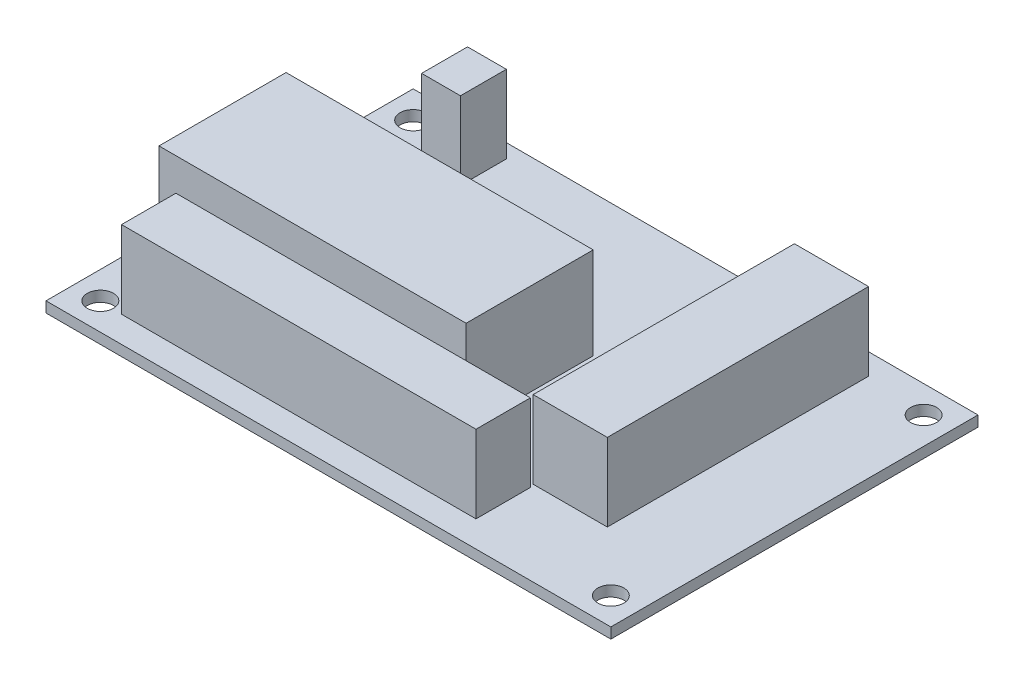
ISO-10303-21;
HEADER;
FILE_DESCRIPTION(('STEP AP214'),'2;1');
FILE_NAME('part.step','',(''),(''),'','','');
FILE_SCHEMA(('AUTOMOTIVE_DESIGN { 1 0 10303 214 1 1 1 1 }'));
ENDSEC;
DATA;
#1=APPLICATION_CONTEXT('core data for automotive mechanical design processes');
#2=APPLICATION_PROTOCOL_DEFINITION('international standard','automotive_design',2000,#1);
#3=PRODUCT_CONTEXT('',#1,'mechanical');
#4=PRODUCT('Part','Part','',(#3));
#5=PRODUCT_RELATED_PRODUCT_CATEGORY('part','',(#4));
#6=PRODUCT_DEFINITION_FORMATION('','',#4);
#7=PRODUCT_DEFINITION_CONTEXT('part definition',#1,'design');
#8=PRODUCT_DEFINITION('design','',#6,#7);
#9=PRODUCT_DEFINITION_SHAPE('','',#8);
#10=(LENGTH_UNIT() NAMED_UNIT(*) SI_UNIT(.MILLI.,.METRE.));
#11=(NAMED_UNIT(*) PLANE_ANGLE_UNIT() SI_UNIT($,.RADIAN.));
#12=(NAMED_UNIT(*) SI_UNIT($,.STERADIAN.) SOLID_ANGLE_UNIT());
#13=UNCERTAINTY_MEASURE_WITH_UNIT(LENGTH_MEASURE(1.E-05),#10,'distance_accuracy_value','');
#14=(GEOMETRIC_REPRESENTATION_CONTEXT(3) GLOBAL_UNCERTAINTY_ASSIGNED_CONTEXT((#13)) GLOBAL_UNIT_ASSIGNED_CONTEXT((#10,
#11,#12)) REPRESENTATION_CONTEXT('',''));
#15=CARTESIAN_POINT('',(0.,0.,0.));
#16=DIRECTION('',(0.,0.,1.));
#17=DIRECTION('',(1.,0.,0.));
#18=AXIS2_PLACEMENT_3D('',#15,#16,#17);
#19=CARTESIAN_POINT('',(0.,1.5,0.));
#20=DIRECTION('',(0.,-1.,0.));
#21=DIRECTION('',(0.,0.,-1.));
#22=AXIS2_PLACEMENT_3D('',#19,#20,#21);
#23=PLANE('',#22);
#24=DIRECTION('',(0.,0.,1.));
#25=VECTOR('',#24,1.);
#26=CARTESIAN_POINT('',(7.,1.5,-11.4));
#27=LINE('',#26,#25);
#28=CARTESIAN_POINT('',(7.,1.5,-11.4));
#29=VERTEX_POINT('',#28);
#30=CARTESIAN_POINT('',(7.,1.5,-3.7));
#31=VERTEX_POINT('',#30);
#32=EDGE_CURVE('E193',#29,#31,#27,.T.);
#33=ORIENTED_EDGE('',*,*,#32,.F.);
#34=DIRECTION('',(-1.,0.,0.));
#35=VECTOR('',#34,1.);
#36=CARTESIAN_POINT('',(7.,1.5,-11.4));
#37=LINE('',#36,#35);
#38=CARTESIAN_POINT('',(57.2,1.5,-11.4));
#39=VERTEX_POINT('',#38);
#40=EDGE_CURVE('E206',#39,#29,#37,.T.);
#41=ORIENTED_EDGE('',*,*,#40,.F.);
#42=DIRECTION('',(0.,0.,-1.));
#43=VECTOR('',#42,1.);
#44=CARTESIAN_POINT('',(57.2,1.5,-11.4));
#45=LINE('',#44,#43);
#46=CARTESIAN_POINT('',(57.2,1.5,-3.7));
#47=VERTEX_POINT('',#46);
#48=EDGE_CURVE('E215',#47,#39,#45,.T.);
#49=ORIENTED_EDGE('',*,*,#48,.F.);
#50=DIRECTION('',(1.,0.,0.));
#51=VECTOR('',#50,1.);
#52=CARTESIAN_POINT('',(7.,1.5,-3.7));
#53=LINE('',#52,#51);
#54=EDGE_CURVE('E196',#31,#47,#53,.T.);
#55=ORIENTED_EDGE('',*,*,#54,.F.);
#56=EDGE_LOOP('',(#33,#41,#49,#55));
#57=FACE_BOUND('',#56,.T.);
#58=DIRECTION('',(0.,0.,1.));
#59=VECTOR('',#58,1.);
#60=CARTESIAN_POINT('',(2.,1.5,-32.));
#61=LINE('',#60,#59);
#62=CARTESIAN_POINT('',(2.,1.5,-32.));
#63=VERTEX_POINT('',#62);
#64=CARTESIAN_POINT('',(2.,1.5,-14.));
#65=VERTEX_POINT('',#64);
#66=EDGE_CURVE('E264',#63,#65,#61,.T.);
#67=ORIENTED_EDGE('',*,*,#66,.F.);
#68=DIRECTION('',(-1.,0.,0.));
#69=VECTOR('',#68,1.);
#70=CARTESIAN_POINT('',(2.,1.5,-32.));
#71=LINE('',#70,#69);
#72=CARTESIAN_POINT('',(45.5,1.5,-32.));
#73=VERTEX_POINT('',#72);
#74=EDGE_CURVE('E269',#73,#63,#71,.T.);
#75=ORIENTED_EDGE('',*,*,#74,.F.);
#76=DIRECTION('',(0.,0.,-1.));
#77=VECTOR('',#76,1.);
#78=CARTESIAN_POINT('',(45.5,1.5,-32.));
#79=LINE('',#78,#77);
#80=CARTESIAN_POINT('',(45.5,1.5,-14.));
#81=VERTEX_POINT('',#80);
#82=EDGE_CURVE('E281',#81,#73,#79,.T.);
#83=ORIENTED_EDGE('',*,*,#82,.F.);
#84=DIRECTION('',(1.,0.,0.));
#85=VECTOR('',#84,1.);
#86=CARTESIAN_POINT('',(2.,1.5,-14.));
#87=LINE('',#86,#85);
#88=EDGE_CURVE('E278',#65,#81,#87,.T.);
#89=ORIENTED_EDGE('',*,*,#88,.F.);
#90=EDGE_LOOP('',(#67,#75,#83,#89));
#91=FACE_BOUND('',#90,.T.);
#92=CARTESIAN_POINT('',(76.15,1.5,-48.15));
#93=DIRECTION('',(0.,1.,0.));
#94=DIRECTION('',(0.,0.,1.));
#95=AXIS2_PLACEMENT_3D('',#92,#93,#94);
#96=CIRCLE('',#95,1.85000000000001);
#97=CARTESIAN_POINT('',(76.15,1.5,-46.3));
#98=VERTEX_POINT('',#97);
#99=EDGE_CURVE('E304',#98,#98,#96,.T.);
#100=ORIENTED_EDGE('',*,*,#99,.F.);
#101=EDGE_LOOP('',(#100));
#102=FACE_BOUND('',#101,.T.);
#103=CARTESIAN_POINT('',(3.85,1.5,-48.15));
#104=DIRECTION('',(0.,1.,0.));
#105=DIRECTION('',(0.,0.,1.));
#106=AXIS2_PLACEMENT_3D('',#103,#104,#105);
#107=CIRCLE('',#106,1.85);
#108=CARTESIAN_POINT('',(3.85,1.5,-46.3));
#109=VERTEX_POINT('',#108);
#110=EDGE_CURVE('E316',#109,#109,#107,.T.);
#111=ORIENTED_EDGE('',*,*,#110,.F.);
#112=EDGE_LOOP('',(#111));
#113=FACE_BOUND('',#112,.T.);
#114=DIRECTION('',(0.,0.,1.));
#115=VECTOR('',#114,1.);
#116=CARTESIAN_POINT('',(0.,1.5,0.));
#117=LINE('',#116,#115);
#118=CARTESIAN_POINT('',(0.,1.5,-52.));
#119=VERTEX_POINT('',#118);
#120=CARTESIAN_POINT('',(0.,1.5,0.));
#121=VERTEX_POINT('',#120);
#122=EDGE_CURVE('E322',#119,#121,#117,.T.);
#123=ORIENTED_EDGE('',*,*,#122,.T.);
#124=DIRECTION('',(1.,0.,0.));
#125=VECTOR('',#124,1.);
#126=CARTESIAN_POINT('',(0.,1.5,0.));
#127=LINE('',#126,#125);
#128=CARTESIAN_POINT('',(80.,1.5,0.));
#129=VERTEX_POINT('',#128);
#130=EDGE_CURVE('E325',#121,#129,#127,.T.);
#131=ORIENTED_EDGE('',*,*,#130,.T.);
#132=DIRECTION('',(0.,0.,-1.));
#133=VECTOR('',#132,1.);
#134=CARTESIAN_POINT('',(80.,1.5,0.));
#135=LINE('',#134,#133);
#136=CARTESIAN_POINT('',(80.,1.5,-52.));
#137=VERTEX_POINT('',#136);
#138=EDGE_CURVE('E328',#129,#137,#135,.T.);
#139=ORIENTED_EDGE('',*,*,#138,.T.);
#140=DIRECTION('',(-1.,0.,0.));
#141=VECTOR('',#140,1.);
#142=CARTESIAN_POINT('',(0.,1.5,-52.));
#143=LINE('',#142,#141);
#144=EDGE_CURVE('E330',#137,#119,#143,.T.);
#145=ORIENTED_EDGE('',*,*,#144,.T.);
#146=EDGE_LOOP('',(#123,#131,#139,#145));
#147=FACE_BOUND('',#146,.T.);
#148=CARTESIAN_POINT('',(3.85,1.5,-3.85));
#149=DIRECTION('',(0.,1.,0.));
#150=DIRECTION('',(0.,0.,1.));
#151=AXIS2_PLACEMENT_3D('',#148,#149,#150);
#152=CIRCLE('',#151,1.85);
#153=CARTESIAN_POINT('',(3.85,1.5,-2.));
#154=VERTEX_POINT('',#153);
#155=EDGE_CURVE('E310',#154,#154,#152,.T.);
#156=ORIENTED_EDGE('',*,*,#155,.F.);
#157=EDGE_LOOP('',(#156));
#158=FACE_BOUND('',#157,.T.);
#159=CARTESIAN_POINT('',(76.15,1.5,-3.85));
#160=DIRECTION('',(0.,1.,0.));
#161=DIRECTION('',(0.,0.,1.));
#162=AXIS2_PLACEMENT_3D('',#159,#160,#161);
#163=CIRCLE('',#162,1.85);
#164=CARTESIAN_POINT('',(76.15,1.5,-1.99999999999999));
#165=VERTEX_POINT('',#164);
#166=EDGE_CURVE('E298',#165,#165,#163,.T.);
#167=ORIENTED_EDGE('',*,*,#166,.F.);
#168=EDGE_LOOP('',(#167));
#169=FACE_BOUND('',#168,.T.);
#170=DIRECTION('',(0.,0.,1.));
#171=VECTOR('',#170,1.);
#172=CARTESIAN_POINT('',(57.,1.5,-49.));
#173=LINE('',#172,#171);
#174=CARTESIAN_POINT('',(57.,1.5,-49.));
#175=VERTEX_POINT('',#174);
#176=CARTESIAN_POINT('',(57.,1.5,-12.));
#177=VERTEX_POINT('',#176);
#178=EDGE_CURVE('E231',#175,#177,#173,.T.);
#179=ORIENTED_EDGE('',*,*,#178,.F.);
#180=DIRECTION('',(-1.,0.,0.));
#181=VECTOR('',#180,1.);
#182=CARTESIAN_POINT('',(57.,1.5,-49.));
#183=LINE('',#182,#181);
#184=CARTESIAN_POINT('',(67.5,1.5,-49.));
#185=VERTEX_POINT('',#184);
#186=EDGE_CURVE('E236',#185,#175,#183,.T.);
#187=ORIENTED_EDGE('',*,*,#186,.F.);
#188=DIRECTION('',(0.,0.,-1.));
#189=VECTOR('',#188,1.);
#190=CARTESIAN_POINT('',(67.5,1.5,-49.));
#191=LINE('',#190,#189);
#192=CARTESIAN_POINT('',(67.5,1.5,-12.));
#193=VERTEX_POINT('',#192);
#194=EDGE_CURVE('E248',#193,#185,#191,.T.);
#195=ORIENTED_EDGE('',*,*,#194,.F.);
#196=DIRECTION('',(1.,0.,0.));
#197=VECTOR('',#196,1.);
#198=CARTESIAN_POINT('',(57.,1.5,-12.));
#199=LINE('',#198,#197);
#200=EDGE_CURVE('E245',#177,#193,#199,.T.);
#201=ORIENTED_EDGE('',*,*,#200,.F.);
#202=EDGE_LOOP('',(#179,#187,#195,#201));
#203=FACE_BOUND('',#202,.T.);
#204=DIRECTION('',(0.,0.,1.));
#205=VECTOR('',#204,1.);
#206=CARTESIAN_POINT('',(9.69999999999999,1.5,-43.5));
#207=LINE('',#206,#205);
#208=CARTESIAN_POINT('',(9.69999999999999,1.5,-50.));
#209=VERTEX_POINT('',#208);
#210=CARTESIAN_POINT('',(9.69999999999999,1.5,-43.5));
#211=VERTEX_POINT('',#210);
#212=EDGE_CURVE('E192',#209,#211,#207,.T.);
#213=ORIENTED_EDGE('',*,*,#212,.F.);
#214=DIRECTION('',(-1.,0.,0.));
#215=VECTOR('',#214,1.);
#216=CARTESIAN_POINT('',(9.69999999999999,1.5,-50.));
#217=LINE('',#216,#215);
#218=CARTESIAN_POINT('',(15.2,1.5,-50.));
#219=VERTEX_POINT('',#218);
#220=EDGE_CURVE('E189',#219,#209,#217,.T.);
#221=ORIENTED_EDGE('',*,*,#220,.F.);
#222=DIRECTION('',(0.,0.,-1.));
#223=VECTOR('',#222,1.);
#224=CARTESIAN_POINT('',(15.2,1.5,-43.5));
#225=LINE('',#224,#223);
#226=CARTESIAN_POINT('',(15.2,1.5,-43.5));
#227=VERTEX_POINT('',#226);
#228=EDGE_CURVE('E55',#227,#219,#225,.T.);
#229=ORIENTED_EDGE('',*,*,#228,.F.);
#230=DIRECTION('',(1.,0.,0.));
#231=VECTOR('',#230,1.);
#232=CARTESIAN_POINT('',(9.69999999999999,1.5,-43.5));
#233=LINE('',#232,#231);
#234=EDGE_CURVE('E50',#211,#227,#233,.T.);
#235=ORIENTED_EDGE('',*,*,#234,.F.);
#236=EDGE_LOOP('',(#213,#221,#229,#235));
#237=FACE_BOUND('',#236,.T.);
#238=ADVANCED_FACE('F35',(#57,#91,#102,#113,#147,#158,#169,#203,#237),#23,.F.);
#239=CARTESIAN_POINT('',(0.,0.,0.));
#240=DIRECTION('',(0.,-1.,0.));
#241=DIRECTION('',(0.,0.,-1.));
#242=AXIS2_PLACEMENT_3D('',#239,#240,#241);
#243=PLANE('',#242);
#244=CARTESIAN_POINT('',(76.15,0.,-48.15));
#245=DIRECTION('',(0.,1.,0.));
#246=DIRECTION('',(0.,0.,1.));
#247=AXIS2_PLACEMENT_3D('',#244,#245,#246);
#248=CIRCLE('',#247,1.85000000000001);
#249=CARTESIAN_POINT('',(76.15,0.,-46.3));
#250=VERTEX_POINT('',#249);
#251=EDGE_CURVE('E301',#250,#250,#248,.T.);
#252=ORIENTED_EDGE('',*,*,#251,.T.);
#253=EDGE_LOOP('',(#252));
#254=FACE_BOUND('',#253,.T.);
#255=CARTESIAN_POINT('',(3.85,0.,-48.15));
#256=DIRECTION('',(0.,1.,0.));
#257=DIRECTION('',(0.,0.,1.));
#258=AXIS2_PLACEMENT_3D('',#255,#256,#257);
#259=CIRCLE('',#258,1.85);
#260=CARTESIAN_POINT('',(3.85,0.,-46.3));
#261=VERTEX_POINT('',#260);
#262=EDGE_CURVE('E313',#261,#261,#259,.T.);
#263=ORIENTED_EDGE('',*,*,#262,.T.);
#264=EDGE_LOOP('',(#263));
#265=FACE_BOUND('',#264,.T.);
#266=DIRECTION('',(0.,0.,1.));
#267=VECTOR('',#266,1.);
#268=CARTESIAN_POINT('',(0.,0.,0.));
#269=LINE('',#268,#267);
#270=CARTESIAN_POINT('',(0.,0.,-52.));
#271=VERTEX_POINT('',#270);
#272=CARTESIAN_POINT('',(0.,0.,0.));
#273=VERTEX_POINT('',#272);
#274=EDGE_CURVE('E319',#271,#273,#269,.T.);
#275=ORIENTED_EDGE('',*,*,#274,.F.);
#276=DIRECTION('',(-1.,0.,0.));
#277=VECTOR('',#276,1.);
#278=CARTESIAN_POINT('',(0.,0.,-52.));
#279=LINE('',#278,#277);
#280=CARTESIAN_POINT('',(80.,0.,-52.));
#281=VERTEX_POINT('',#280);
#282=EDGE_CURVE('E326',#281,#271,#279,.T.);
#283=ORIENTED_EDGE('',*,*,#282,.F.);
#284=DIRECTION('',(0.,0.,-1.));
#285=VECTOR('',#284,1.);
#286=CARTESIAN_POINT('',(80.,0.,0.));
#287=LINE('',#286,#285);
#288=CARTESIAN_POINT('',(80.,0.,0.));
#289=VERTEX_POINT('',#288);
#290=EDGE_CURVE('E337',#289,#281,#287,.T.);
#291=ORIENTED_EDGE('',*,*,#290,.F.);
#292=DIRECTION('',(1.,0.,0.));
#293=VECTOR('',#292,1.);
#294=CARTESIAN_POINT('',(0.,0.,0.));
#295=LINE('',#294,#293);
#296=EDGE_CURVE('E335',#273,#289,#295,.T.);
#297=ORIENTED_EDGE('',*,*,#296,.F.);
#298=EDGE_LOOP('',(#275,#283,#291,#297));
#299=FACE_BOUND('',#298,.T.);
#300=CARTESIAN_POINT('',(3.85,0.,-3.85));
#301=DIRECTION('',(0.,1.,0.));
#302=DIRECTION('',(0.,0.,1.));
#303=AXIS2_PLACEMENT_3D('',#300,#301,#302);
#304=CIRCLE('',#303,1.85);
#305=CARTESIAN_POINT('',(3.85,0.,-2.));
#306=VERTEX_POINT('',#305);
#307=EDGE_CURVE('E307',#306,#306,#304,.T.);
#308=ORIENTED_EDGE('',*,*,#307,.T.);
#309=EDGE_LOOP('',(#308));
#310=FACE_BOUND('',#309,.T.);
#311=CARTESIAN_POINT('',(76.15,0.,-3.85));
#312=DIRECTION('',(0.,1.,0.));
#313=DIRECTION('',(0.,0.,1.));
#314=AXIS2_PLACEMENT_3D('',#311,#312,#313);
#315=CIRCLE('',#314,1.85);
#316=CARTESIAN_POINT('',(76.15,0.,-1.99999999999999));
#317=VERTEX_POINT('',#316);
#318=EDGE_CURVE('E297',#317,#317,#315,.T.);
#319=ORIENTED_EDGE('',*,*,#318,.T.);
#320=EDGE_LOOP('',(#319));
#321=FACE_BOUND('',#320,.T.);
#322=ADVANCED_FACE('F355',(#254,#265,#299,#310,#321),#243,.T.);
#323=CARTESIAN_POINT('',(0.,1.5,0.));
#324=DIRECTION('',(1.,0.,0.));
#325=DIRECTION('',(0.,0.,-1.));
#326=AXIS2_PLACEMENT_3D('',#323,#324,#325);
#327=PLANE('',#326);
#328=ORIENTED_EDGE('',*,*,#274,.T.);
#329=DIRECTION('',(0.,-1.,0.));
#330=VECTOR('',#329,1.);
#331=CARTESIAN_POINT('',(0.,1.5,0.));
#332=LINE('',#331,#330);
#333=EDGE_CURVE('E11',#121,#273,#332,.T.);
#334=ORIENTED_EDGE('',*,*,#333,.F.);
#335=ORIENTED_EDGE('',*,*,#122,.F.);
#336=DIRECTION('',(0.,-1.,0.));
#337=VECTOR('',#336,1.);
#338=CARTESIAN_POINT('',(0.,1.5,-52.));
#339=LINE('',#338,#337);
#340=EDGE_CURVE('E332',#119,#271,#339,.T.);
#341=ORIENTED_EDGE('',*,*,#340,.T.);
#342=EDGE_LOOP('',(#328,#334,#335,#341));
#343=FACE_BOUND('',#342,.T.);
#344=ADVANCED_FACE('F37',(#343),#327,.F.);
#345=CARTESIAN_POINT('',(0.,1.5,0.));
#346=DIRECTION('',(0.,0.,-1.));
#347=DIRECTION('',(-1.,0.,0.));
#348=AXIS2_PLACEMENT_3D('',#345,#346,#347);
#349=PLANE('',#348);
#350=ORIENTED_EDGE('',*,*,#296,.T.);
#351=DIRECTION('',(0.,-1.,0.));
#352=VECTOR('',#351,1.);
#353=CARTESIAN_POINT('',(80.,1.5,0.));
#354=LINE('',#353,#352);
#355=EDGE_CURVE('E43',#129,#289,#354,.T.);
#356=ORIENTED_EDGE('',*,*,#355,.F.);
#357=ORIENTED_EDGE('',*,*,#130,.F.);
#358=ORIENTED_EDGE('',*,*,#333,.T.);
#359=EDGE_LOOP('',(#350,#356,#357,#358));
#360=FACE_BOUND('',#359,.T.);
#361=ADVANCED_FACE('F366',(#360),#349,.F.);
#362=CARTESIAN_POINT('',(80.,1.5,0.));
#363=DIRECTION('',(-1.,0.,0.));
#364=DIRECTION('',(0.,0.,1.));
#365=AXIS2_PLACEMENT_3D('',#362,#363,#364);
#366=PLANE('',#365);
#367=ORIENTED_EDGE('',*,*,#290,.T.);
#368=DIRECTION('',(0.,-1.,0.));
#369=VECTOR('',#368,1.);
#370=CARTESIAN_POINT('',(80.,1.5,-52.));
#371=LINE('',#370,#369);
#372=EDGE_CURVE('E342',#137,#281,#371,.T.);
#373=ORIENTED_EDGE('',*,*,#372,.F.);
#374=ORIENTED_EDGE('',*,*,#138,.F.);
#375=ORIENTED_EDGE('',*,*,#355,.T.);
#376=EDGE_LOOP('',(#367,#373,#374,#375));
#377=FACE_BOUND('',#376,.T.);
#378=ADVANCED_FACE('F349',(#377),#366,.F.);
#379=CARTESIAN_POINT('',(0.,1.5,-52.));
#380=DIRECTION('',(0.,0.,1.));
#381=DIRECTION('',(1.,0.,0.));
#382=AXIS2_PLACEMENT_3D('',#379,#380,#381);
#383=PLANE('',#382);
#384=ORIENTED_EDGE('',*,*,#282,.T.);
#385=ORIENTED_EDGE('',*,*,#340,.F.);
#386=ORIENTED_EDGE('',*,*,#144,.F.);
#387=ORIENTED_EDGE('',*,*,#372,.T.);
#388=EDGE_LOOP('',(#384,#385,#386,#387));
#389=FACE_BOUND('',#388,.T.);
#390=ADVANCED_FACE('F359',(#389),#383,.F.);
#391=CARTESIAN_POINT('',(3.85,1.5,-48.15));
#392=DIRECTION('',(0.,-1.,0.));
#393=DIRECTION('',(0.,0.,-1.));
#394=AXIS2_PLACEMENT_3D('',#391,#392,#393);
#395=CYLINDRICAL_SURFACE('',#394,1.85);
#396=ORIENTED_EDGE('',*,*,#110,.T.);
#397=EDGE_LOOP('',(#396));
#398=FACE_BOUND('',#397,.T.);
#399=ORIENTED_EDGE('',*,*,#262,.F.);
#400=EDGE_LOOP('',(#399));
#401=FACE_BOUND('',#400,.T.);
#402=ADVANCED_FACE('F385',(#398,#401),#395,.F.);
#403=CARTESIAN_POINT('',(3.85,1.5,-3.85));
#404=DIRECTION('',(0.,-1.,0.));
#405=DIRECTION('',(0.,0.,-1.));
#406=AXIS2_PLACEMENT_3D('',#403,#404,#405);
#407=CYLINDRICAL_SURFACE('',#406,1.85);
#408=ORIENTED_EDGE('',*,*,#155,.T.);
#409=EDGE_LOOP('',(#408));
#410=FACE_BOUND('',#409,.T.);
#411=ORIENTED_EDGE('',*,*,#307,.F.);
#412=EDGE_LOOP('',(#411));
#413=FACE_BOUND('',#412,.T.);
#414=ADVANCED_FACE('F392',(#410,#413),#407,.F.);
#415=CARTESIAN_POINT('',(76.15,1.5,-48.15));
#416=DIRECTION('',(0.,-1.,0.));
#417=DIRECTION('',(0.,0.,-1.));
#418=AXIS2_PLACEMENT_3D('',#415,#416,#417);
#419=CYLINDRICAL_SURFACE('',#418,1.85000000000001);
#420=ORIENTED_EDGE('',*,*,#99,.T.);
#421=EDGE_LOOP('',(#420));
#422=FACE_BOUND('',#421,.T.);
#423=ORIENTED_EDGE('',*,*,#251,.F.);
#424=EDGE_LOOP('',(#423));
#425=FACE_BOUND('',#424,.T.);
#426=ADVANCED_FACE('F397',(#422,#425),#419,.F.);
#427=CARTESIAN_POINT('',(76.15,1.5,-3.85));
#428=DIRECTION('',(0.,-1.,0.));
#429=DIRECTION('',(0.,0.,-1.));
#430=AXIS2_PLACEMENT_3D('',#427,#428,#429);
#431=CYLINDRICAL_SURFACE('',#430,1.85);
#432=ORIENTED_EDGE('',*,*,#166,.T.);
#433=EDGE_LOOP('',(#432));
#434=FACE_BOUND('',#433,.T.);
#435=ORIENTED_EDGE('',*,*,#318,.F.);
#436=EDGE_LOOP('',(#435));
#437=FACE_BOUND('',#436,.T.);
#438=ADVANCED_FACE('F407',(#434,#437),#431,.F.);
#439=CARTESIAN_POINT('',(2.,14.5,-32.));
#440=DIRECTION('',(1.,0.,0.));
#441=DIRECTION('',(0.,0.,-1.));
#442=AXIS2_PLACEMENT_3D('',#439,#440,#441);
#443=PLANE('',#442);
#444=ORIENTED_EDGE('',*,*,#66,.T.);
#445=DIRECTION('',(0.,-1.,0.));
#446=VECTOR('',#445,1.);
#447=CARTESIAN_POINT('',(2.,14.5,-14.));
#448=LINE('',#447,#446);
#449=CARTESIAN_POINT('',(2.,14.5,-14.));
#450=VERTEX_POINT('',#449);
#451=EDGE_CURVE('E294',#450,#65,#448,.T.);
#452=ORIENTED_EDGE('',*,*,#451,.F.);
#453=DIRECTION('',(0.,0.,1.));
#454=VECTOR('',#453,1.);
#455=CARTESIAN_POINT('',(2.,14.5,-32.));
#456=LINE('',#455,#454);
#457=CARTESIAN_POINT('',(2.,14.5,-32.));
#458=VERTEX_POINT('',#457);
#459=EDGE_CURVE('E265',#458,#450,#456,.T.);
#460=ORIENTED_EDGE('',*,*,#459,.F.);
#461=DIRECTION('',(0.,-1.,0.));
#462=VECTOR('',#461,1.);
#463=CARTESIAN_POINT('',(2.,14.5,-32.));
#464=LINE('',#463,#462);
#465=EDGE_CURVE('E275',#458,#63,#464,.T.);
#466=ORIENTED_EDGE('',*,*,#465,.T.);
#467=EDGE_LOOP('',(#444,#452,#460,#466));
#468=FACE_BOUND('',#467,.T.);
#469=ADVANCED_FACE('F414',(#468),#443,.F.);
#470=CARTESIAN_POINT('',(2.,14.5,-14.));
#471=DIRECTION('',(0.,0.,-1.));
#472=DIRECTION('',(-1.,0.,0.));
#473=AXIS2_PLACEMENT_3D('',#470,#471,#472);
#474=PLANE('',#473);
#475=ORIENTED_EDGE('',*,*,#88,.T.);
#476=DIRECTION('',(0.,-1.,0.));
#477=VECTOR('',#476,1.);
#478=CARTESIAN_POINT('',(45.5,14.5,-14.));
#479=LINE('',#478,#477);
#480=CARTESIAN_POINT('',(45.5,14.5,-14.));
#481=VERTEX_POINT('',#480);
#482=EDGE_CURVE('E291',#481,#81,#479,.T.);
#483=ORIENTED_EDGE('',*,*,#482,.F.);
#484=DIRECTION('',(1.,0.,0.));
#485=VECTOR('',#484,1.);
#486=CARTESIAN_POINT('',(2.,14.5,-14.));
#487=LINE('',#486,#485);
#488=EDGE_CURVE('E268',#450,#481,#487,.T.);
#489=ORIENTED_EDGE('',*,*,#488,.F.);
#490=ORIENTED_EDGE('',*,*,#451,.T.);
#491=EDGE_LOOP('',(#475,#483,#489,#490));
#492=FACE_BOUND('',#491,.T.);
#493=ADVANCED_FACE('F418',(#492),#474,.F.);
#494=CARTESIAN_POINT('',(45.5,14.5,-32.));
#495=DIRECTION('',(-1.,0.,0.));
#496=DIRECTION('',(0.,0.,1.));
#497=AXIS2_PLACEMENT_3D('',#494,#495,#496);
#498=PLANE('',#497);
#499=ORIENTED_EDGE('',*,*,#82,.T.);
#500=DIRECTION('',(0.,-1.,0.));
#501=VECTOR('',#500,1.);
#502=CARTESIAN_POINT('',(45.5,14.5,-32.));
#503=LINE('',#502,#501);
#504=CARTESIAN_POINT('',(45.5,14.5,-32.));
#505=VERTEX_POINT('',#504);
#506=EDGE_CURVE('E288',#505,#73,#503,.T.);
#507=ORIENTED_EDGE('',*,*,#506,.F.);
#508=DIRECTION('',(0.,0.,-1.));
#509=VECTOR('',#508,1.);
#510=CARTESIAN_POINT('',(45.5,14.5,-32.));
#511=LINE('',#510,#509);
#512=EDGE_CURVE('E271',#481,#505,#511,.T.);
#513=ORIENTED_EDGE('',*,*,#512,.F.);
#514=ORIENTED_EDGE('',*,*,#482,.T.);
#515=EDGE_LOOP('',(#499,#507,#513,#514));
#516=FACE_BOUND('',#515,.T.);
#517=ADVANCED_FACE('F422',(#516),#498,.F.);
#518=CARTESIAN_POINT('',(2.,14.5,-32.));
#519=DIRECTION('',(0.,0.,1.));
#520=DIRECTION('',(1.,0.,0.));
#521=AXIS2_PLACEMENT_3D('',#518,#519,#520);
#522=PLANE('',#521);
#523=ORIENTED_EDGE('',*,*,#74,.T.);
#524=ORIENTED_EDGE('',*,*,#465,.F.);
#525=DIRECTION('',(-1.,0.,0.));
#526=VECTOR('',#525,1.);
#527=CARTESIAN_POINT('',(2.,14.5,-32.));
#528=LINE('',#527,#526);
#529=EDGE_CURVE('E273',#505,#458,#528,.T.);
#530=ORIENTED_EDGE('',*,*,#529,.F.);
#531=ORIENTED_EDGE('',*,*,#506,.T.);
#532=EDGE_LOOP('',(#523,#524,#530,#531));
#533=FACE_BOUND('',#532,.T.);
#534=ADVANCED_FACE('F426',(#533),#522,.F.);
#535=CARTESIAN_POINT('',(0.,14.5,0.));
#536=DIRECTION('',(0.,1.,0.));
#537=DIRECTION('',(0.,0.,1.));
#538=AXIS2_PLACEMENT_3D('',#535,#536,#537);
#539=PLANE('',#538);
#540=ORIENTED_EDGE('',*,*,#459,.T.);
#541=ORIENTED_EDGE('',*,*,#488,.T.);
#542=ORIENTED_EDGE('',*,*,#512,.T.);
#543=ORIENTED_EDGE('',*,*,#529,.T.);
#544=EDGE_LOOP('',(#540,#541,#542,#543));
#545=FACE_BOUND('',#544,.T.);
#546=ADVANCED_FACE('F430',(#545),#539,.T.);
#547=CARTESIAN_POINT('',(57.,12.5,-49.));
#548=DIRECTION('',(1.,0.,0.));
#549=DIRECTION('',(0.,0.,-1.));
#550=AXIS2_PLACEMENT_3D('',#547,#548,#549);
#551=PLANE('',#550);
#552=ORIENTED_EDGE('',*,*,#178,.T.);
#553=DIRECTION('',(0.,-1.,0.));
#554=VECTOR('',#553,1.);
#555=CARTESIAN_POINT('',(57.,12.5,-12.));
#556=LINE('',#555,#554);
#557=CARTESIAN_POINT('',(57.,12.5,-12.));
#558=VERTEX_POINT('',#557);
#559=EDGE_CURVE('E261',#558,#177,#556,.T.);
#560=ORIENTED_EDGE('',*,*,#559,.F.);
#561=DIRECTION('',(0.,0.,1.));
#562=VECTOR('',#561,1.);
#563=CARTESIAN_POINT('',(57.,12.5,-49.));
#564=LINE('',#563,#562);
#565=CARTESIAN_POINT('',(57.,12.5,-49.));
#566=VERTEX_POINT('',#565);
#567=EDGE_CURVE('E232',#566,#558,#564,.T.);
#568=ORIENTED_EDGE('',*,*,#567,.F.);
#569=DIRECTION('',(0.,-1.,0.));
#570=VECTOR('',#569,1.);
#571=CARTESIAN_POINT('',(57.,12.5,-49.));
#572=LINE('',#571,#570);
#573=EDGE_CURVE('E242',#566,#175,#572,.T.);
#574=ORIENTED_EDGE('',*,*,#573,.T.);
#575=EDGE_LOOP('',(#552,#560,#568,#574));
#576=FACE_BOUND('',#575,.T.);
#577=ADVANCED_FACE('F434',(#576),#551,.F.);
#578=CARTESIAN_POINT('',(57.,12.5,-12.));
#579=DIRECTION('',(0.,0.,-1.));
#580=DIRECTION('',(-1.,0.,0.));
#581=AXIS2_PLACEMENT_3D('',#578,#579,#580);
#582=PLANE('',#581);
#583=ORIENTED_EDGE('',*,*,#200,.T.);
#584=DIRECTION('',(0.,-1.,0.));
#585=VECTOR('',#584,1.);
#586=CARTESIAN_POINT('',(67.5,12.5,-12.));
#587=LINE('',#586,#585);
#588=CARTESIAN_POINT('',(67.5,12.5,-12.));
#589=VERTEX_POINT('',#588);
#590=EDGE_CURVE('E258',#589,#193,#587,.T.);
#591=ORIENTED_EDGE('',*,*,#590,.F.);
#592=DIRECTION('',(1.,0.,0.));
#593=VECTOR('',#592,1.);
#594=CARTESIAN_POINT('',(57.,12.5,-12.));
#595=LINE('',#594,#593);
#596=EDGE_CURVE('E235',#558,#589,#595,.T.);
#597=ORIENTED_EDGE('',*,*,#596,.F.);
#598=ORIENTED_EDGE('',*,*,#559,.T.);
#599=EDGE_LOOP('',(#583,#591,#597,#598));
#600=FACE_BOUND('',#599,.T.);
#601=ADVANCED_FACE('F438',(#600),#582,.F.);
#602=CARTESIAN_POINT('',(67.5,12.5,-49.));
#603=DIRECTION('',(-1.,0.,0.));
#604=DIRECTION('',(0.,0.,1.));
#605=AXIS2_PLACEMENT_3D('',#602,#603,#604);
#606=PLANE('',#605);
#607=ORIENTED_EDGE('',*,*,#194,.T.);
#608=DIRECTION('',(0.,-1.,0.));
#609=VECTOR('',#608,1.);
#610=CARTESIAN_POINT('',(67.5,12.5,-49.));
#611=LINE('',#610,#609);
#612=CARTESIAN_POINT('',(67.5,12.5,-49.));
#613=VERTEX_POINT('',#612);
#614=EDGE_CURVE('E255',#613,#185,#611,.T.);
#615=ORIENTED_EDGE('',*,*,#614,.F.);
#616=DIRECTION('',(0.,0.,-1.));
#617=VECTOR('',#616,1.);
#618=CARTESIAN_POINT('',(67.5,12.5,-49.));
#619=LINE('',#618,#617);
#620=EDGE_CURVE('E238',#589,#613,#619,.T.);
#621=ORIENTED_EDGE('',*,*,#620,.F.);
#622=ORIENTED_EDGE('',*,*,#590,.T.);
#623=EDGE_LOOP('',(#607,#615,#621,#622));
#624=FACE_BOUND('',#623,.T.);
#625=ADVANCED_FACE('F442',(#624),#606,.F.);
#626=CARTESIAN_POINT('',(57.,12.5,-49.));
#627=DIRECTION('',(0.,0.,1.));
#628=DIRECTION('',(1.,0.,0.));
#629=AXIS2_PLACEMENT_3D('',#626,#627,#628);
#630=PLANE('',#629);
#631=ORIENTED_EDGE('',*,*,#186,.T.);
#632=ORIENTED_EDGE('',*,*,#573,.F.);
#633=DIRECTION('',(-1.,0.,0.));
#634=VECTOR('',#633,1.);
#635=CARTESIAN_POINT('',(57.,12.5,-49.));
#636=LINE('',#635,#634);
#637=EDGE_CURVE('E240',#613,#566,#636,.T.);
#638=ORIENTED_EDGE('',*,*,#637,.F.);
#639=ORIENTED_EDGE('',*,*,#614,.T.);
#640=EDGE_LOOP('',(#631,#632,#638,#639));
#641=FACE_BOUND('',#640,.T.);
#642=ADVANCED_FACE('F446',(#641),#630,.F.);
#643=CARTESIAN_POINT('',(0.,12.5,0.));
#644=DIRECTION('',(0.,1.,0.));
#645=DIRECTION('',(0.,0.,1.));
#646=AXIS2_PLACEMENT_3D('',#643,#644,#645);
#647=PLANE('',#646);
#648=ORIENTED_EDGE('',*,*,#567,.T.);
#649=ORIENTED_EDGE('',*,*,#596,.T.);
#650=ORIENTED_EDGE('',*,*,#620,.T.);
#651=ORIENTED_EDGE('',*,*,#637,.T.);
#652=EDGE_LOOP('',(#648,#649,#650,#651));
#653=FACE_BOUND('',#652,.T.);
#654=ADVANCED_FACE('F450',(#653),#647,.T.);
#655=CARTESIAN_POINT('',(7.,12.5,-11.4));
#656=DIRECTION('',(1.,0.,0.));
#657=DIRECTION('',(0.,0.,-1.));
#658=AXIS2_PLACEMENT_3D('',#655,#656,#657);
#659=PLANE('',#658);
#660=ORIENTED_EDGE('',*,*,#32,.T.);
#661=DIRECTION('',(0.,-1.,0.));
#662=VECTOR('',#661,1.);
#663=CARTESIAN_POINT('',(7.,12.5,-3.7));
#664=LINE('',#663,#662);
#665=CARTESIAN_POINT('',(7.,12.5,-3.7));
#666=VERTEX_POINT('',#665);
#667=EDGE_CURVE('E228',#666,#31,#664,.T.);
#668=ORIENTED_EDGE('',*,*,#667,.F.);
#669=DIRECTION('',(0.,0.,1.));
#670=VECTOR('',#669,1.);
#671=CARTESIAN_POINT('',(7.,12.5,-11.4));
#672=LINE('',#671,#670);
#673=CARTESIAN_POINT('',(7.,12.5,-11.4));
#674=VERTEX_POINT('',#673);
#675=EDGE_CURVE('E202',#674,#666,#672,.T.);
#676=ORIENTED_EDGE('',*,*,#675,.F.);
#677=DIRECTION('',(0.,-1.,0.));
#678=VECTOR('',#677,1.);
#679=CARTESIAN_POINT('',(7.,12.5,-11.4));
#680=LINE('',#679,#678);
#681=EDGE_CURVE('E211',#674,#29,#680,.T.);
#682=ORIENTED_EDGE('',*,*,#681,.T.);
#683=EDGE_LOOP('',(#660,#668,#676,#682));
#684=FACE_BOUND('',#683,.T.);
#685=ADVANCED_FACE('F454',(#684),#659,.F.);
#686=CARTESIAN_POINT('',(7.,12.5,-3.7));
#687=DIRECTION('',(0.,0.,-1.));
#688=DIRECTION('',(-1.,0.,0.));
#689=AXIS2_PLACEMENT_3D('',#686,#687,#688);
#690=PLANE('',#689);
#691=ORIENTED_EDGE('',*,*,#54,.T.);
#692=DIRECTION('',(0.,-1.,0.));
#693=VECTOR('',#692,1.);
#694=CARTESIAN_POINT('',(57.2,12.5,-3.7));
#695=LINE('',#694,#693);
#696=CARTESIAN_POINT('',(57.2,12.5,-3.7));
#697=VERTEX_POINT('',#696);
#698=EDGE_CURVE('E225',#697,#47,#695,.T.);
#699=ORIENTED_EDGE('',*,*,#698,.F.);
#700=DIRECTION('',(1.,0.,0.));
#701=VECTOR('',#700,1.);
#702=CARTESIAN_POINT('',(7.,12.5,-3.7));
#703=LINE('',#702,#701);
#704=EDGE_CURVE('E205',#666,#697,#703,.T.);
#705=ORIENTED_EDGE('',*,*,#704,.F.);
#706=ORIENTED_EDGE('',*,*,#667,.T.);
#707=EDGE_LOOP('',(#691,#699,#705,#706));
#708=FACE_BOUND('',#707,.T.);
#709=ADVANCED_FACE('F458',(#708),#690,.F.);
#710=CARTESIAN_POINT('',(57.2,12.5,-11.4));
#711=DIRECTION('',(-1.,0.,0.));
#712=DIRECTION('',(0.,0.,1.));
#713=AXIS2_PLACEMENT_3D('',#710,#711,#712);
#714=PLANE('',#713);
#715=ORIENTED_EDGE('',*,*,#48,.T.);
#716=DIRECTION('',(0.,-1.,0.));
#717=VECTOR('',#716,1.);
#718=CARTESIAN_POINT('',(57.2,12.5,-11.4));
#719=LINE('',#718,#717);
#720=CARTESIAN_POINT('',(57.2,12.5,-11.4));
#721=VERTEX_POINT('',#720);
#722=EDGE_CURVE('E222',#721,#39,#719,.T.);
#723=ORIENTED_EDGE('',*,*,#722,.F.);
#724=DIRECTION('',(0.,0.,-1.));
#725=VECTOR('',#724,1.);
#726=CARTESIAN_POINT('',(57.2,12.5,-11.4));
#727=LINE('',#726,#725);
#728=EDGE_CURVE('E208',#697,#721,#727,.T.);
#729=ORIENTED_EDGE('',*,*,#728,.F.);
#730=ORIENTED_EDGE('',*,*,#698,.T.);
#731=EDGE_LOOP('',(#715,#723,#729,#730));
#732=FACE_BOUND('',#731,.T.);
#733=ADVANCED_FACE('F462',(#732),#714,.F.);
#734=CARTESIAN_POINT('',(7.,12.5,-11.4));
#735=DIRECTION('',(0.,0.,1.));
#736=DIRECTION('',(1.,0.,0.));
#737=AXIS2_PLACEMENT_3D('',#734,#735,#736);
#738=PLANE('',#737);
#739=ORIENTED_EDGE('',*,*,#40,.T.);
#740=ORIENTED_EDGE('',*,*,#681,.F.);
#741=DIRECTION('',(-1.,0.,0.));
#742=VECTOR('',#741,1.);
#743=CARTESIAN_POINT('',(7.,12.5,-11.4));
#744=LINE('',#743,#742);
#745=EDGE_CURVE('E210',#721,#674,#744,.T.);
#746=ORIENTED_EDGE('',*,*,#745,.F.);
#747=ORIENTED_EDGE('',*,*,#722,.T.);
#748=EDGE_LOOP('',(#739,#740,#746,#747));
#749=FACE_BOUND('',#748,.T.);
#750=ADVANCED_FACE('F466',(#749),#738,.F.);
#751=CARTESIAN_POINT('',(0.,12.5,0.));
#752=DIRECTION('',(0.,1.,0.));
#753=DIRECTION('',(0.,0.,1.));
#754=AXIS2_PLACEMENT_3D('',#751,#752,#753);
#755=PLANE('',#754);
#756=ORIENTED_EDGE('',*,*,#675,.T.);
#757=ORIENTED_EDGE('',*,*,#704,.T.);
#758=ORIENTED_EDGE('',*,*,#728,.T.);
#759=ORIENTED_EDGE('',*,*,#745,.T.);
#760=EDGE_LOOP('',(#756,#757,#758,#759));
#761=FACE_BOUND('',#760,.T.);
#762=ADVANCED_FACE('F470',(#761),#755,.T.);
#763=CARTESIAN_POINT('',(9.69999999999999,12.5,-43.5));
#764=DIRECTION('',(1.,0.,0.));
#765=DIRECTION('',(0.,0.,-1.));
#766=AXIS2_PLACEMENT_3D('',#763,#764,#765);
#767=PLANE('',#766);
#768=ORIENTED_EDGE('',*,*,#212,.T.);
#769=DIRECTION('',(0.,-1.,0.));
#770=VECTOR('',#769,1.);
#771=CARTESIAN_POINT('',(9.69999999999999,12.5,-43.5));
#772=LINE('',#771,#770);
#773=CARTESIAN_POINT('',(9.69999999999999,12.5,-43.5));
#774=VERTEX_POINT('',#773);
#775=EDGE_CURVE('E173',#774,#211,#772,.T.);
#776=ORIENTED_EDGE('',*,*,#775,.F.);
#777=DIRECTION('',(0.,0.,1.));
#778=VECTOR('',#777,1.);
#779=CARTESIAN_POINT('',(9.69999999999999,12.5,-43.5));
#780=LINE('',#779,#778);
#781=CARTESIAN_POINT('',(9.69999999999999,12.5,-50.));
#782=VERTEX_POINT('',#781);
#783=EDGE_CURVE('E180',#782,#774,#780,.T.);
#784=ORIENTED_EDGE('',*,*,#783,.F.);
#785=DIRECTION('',(0.,-1.,0.));
#786=VECTOR('',#785,1.);
#787=CARTESIAN_POINT('',(9.69999999999999,12.5,-50.));
#788=LINE('',#787,#786);
#789=EDGE_CURVE('E668',#782,#209,#788,.T.);
#790=ORIENTED_EDGE('',*,*,#789,.T.);
#791=EDGE_LOOP('',(#768,#776,#784,#790));
#792=FACE_BOUND('',#791,.T.);
#793=ADVANCED_FACE('F191',(#792),#767,.F.);
#794=CARTESIAN_POINT('',(9.69999999999999,12.5,-43.5));
#795=DIRECTION('',(0.,0.,-1.));
#796=DIRECTION('',(-1.,0.,0.));
#797=AXIS2_PLACEMENT_3D('',#794,#795,#796);
#798=PLANE('',#797);
#799=ORIENTED_EDGE('',*,*,#234,.T.);
#800=DIRECTION('',(0.,-1.,0.));
#801=VECTOR('',#800,1.);
#802=CARTESIAN_POINT('',(15.2,12.5,-43.5));
#803=LINE('',#802,#801);
#804=CARTESIAN_POINT('',(15.2,12.5,-43.5));
#805=VERTEX_POINT('',#804);
#806=EDGE_CURVE('E176',#805,#227,#803,.T.);
#807=ORIENTED_EDGE('',*,*,#806,.F.);
#808=DIRECTION('',(1.,0.,0.));
#809=VECTOR('',#808,1.);
#810=CARTESIAN_POINT('',(9.69999999999999,12.5,-43.5));
#811=LINE('',#810,#809);
#812=EDGE_CURVE('E169',#774,#805,#811,.T.);
#813=ORIENTED_EDGE('',*,*,#812,.F.);
#814=ORIENTED_EDGE('',*,*,#775,.T.);
#815=EDGE_LOOP('',(#799,#807,#813,#814));
#816=FACE_BOUND('',#815,.T.);
#817=ADVANCED_FACE('F171',(#816),#798,.F.);
#818=CARTESIAN_POINT('',(15.2,12.5,-43.5));
#819=DIRECTION('',(-1.,0.,0.));
#820=DIRECTION('',(0.,0.,1.));
#821=AXIS2_PLACEMENT_3D('',#818,#819,#820);
#822=PLANE('',#821);
#823=ORIENTED_EDGE('',*,*,#228,.T.);
#824=DIRECTION('',(0.,-1.,0.));
#825=VECTOR('',#824,1.);
#826=CARTESIAN_POINT('',(15.2,12.5,-50.));
#827=LINE('',#826,#825);
#828=CARTESIAN_POINT('',(15.2,12.5,-50.));
#829=VERTEX_POINT('',#828);
#830=EDGE_CURVE('E198',#829,#219,#827,.T.);
#831=ORIENTED_EDGE('',*,*,#830,.F.);
#832=DIRECTION('',(0.,0.,-1.));
#833=VECTOR('',#832,1.);
#834=CARTESIAN_POINT('',(15.2,12.5,-43.5));
#835=LINE('',#834,#833);
#836=EDGE_CURVE('E179',#805,#829,#835,.T.);
#837=ORIENTED_EDGE('',*,*,#836,.F.);
#838=ORIENTED_EDGE('',*,*,#806,.T.);
#839=EDGE_LOOP('',(#823,#831,#837,#838));
#840=FACE_BOUND('',#839,.T.);
#841=ADVANCED_FACE('F479',(#840),#822,.F.);
#842=CARTESIAN_POINT('',(9.69999999999999,12.5,-50.));
#843=DIRECTION('',(0.,0.,1.));
#844=DIRECTION('',(1.,0.,0.));
#845=AXIS2_PLACEMENT_3D('',#842,#843,#844);
#846=PLANE('',#845);
#847=ORIENTED_EDGE('',*,*,#220,.T.);
#848=ORIENTED_EDGE('',*,*,#789,.F.);
#849=DIRECTION('',(-1.,0.,0.));
#850=VECTOR('',#849,1.);
#851=CARTESIAN_POINT('',(9.69999999999999,12.5,-50.));
#852=LINE('',#851,#850);
#853=EDGE_CURVE('E185',#829,#782,#852,.T.);
#854=ORIENTED_EDGE('',*,*,#853,.F.);
#855=ORIENTED_EDGE('',*,*,#830,.T.);
#856=EDGE_LOOP('',(#847,#848,#854,#855));
#857=FACE_BOUND('',#856,.T.);
#858=ADVANCED_FACE('F482',(#857),#846,.F.);
#859=CARTESIAN_POINT('',(0.,12.5,0.));
#860=DIRECTION('',(0.,-1.,0.));
#861=DIRECTION('',(0.,0.,-1.));
#862=AXIS2_PLACEMENT_3D('',#859,#860,#861);
#863=PLANE('',#862);
#864=ORIENTED_EDGE('',*,*,#783,.T.);
#865=ORIENTED_EDGE('',*,*,#812,.T.);
#866=ORIENTED_EDGE('',*,*,#836,.T.);
#867=ORIENTED_EDGE('',*,*,#853,.T.);
#868=EDGE_LOOP('',(#864,#865,#866,#867));
#869=FACE_BOUND('',#868,.T.);
#870=ADVANCED_FACE('F183',(#869),#863,.F.);
#871=CLOSED_SHELL('',(#238,#322,#344,#361,#378,#390,#402,#414,#426,#438,#469,#493,#517,#534,
#546,#577,#601,#625,#642,#654,#685,#709,#733,#750,#762,#793,#817,#841,#858,#870));
#872=MANIFOLD_SOLID_BREP('B2',#871);
#873=ADVANCED_BREP_SHAPE_REPRESENTATION('',(#18,#872),#14);
#874=SHAPE_DEFINITION_REPRESENTATION(#9,#873);
ENDSEC;
END-ISO-10303-21;
